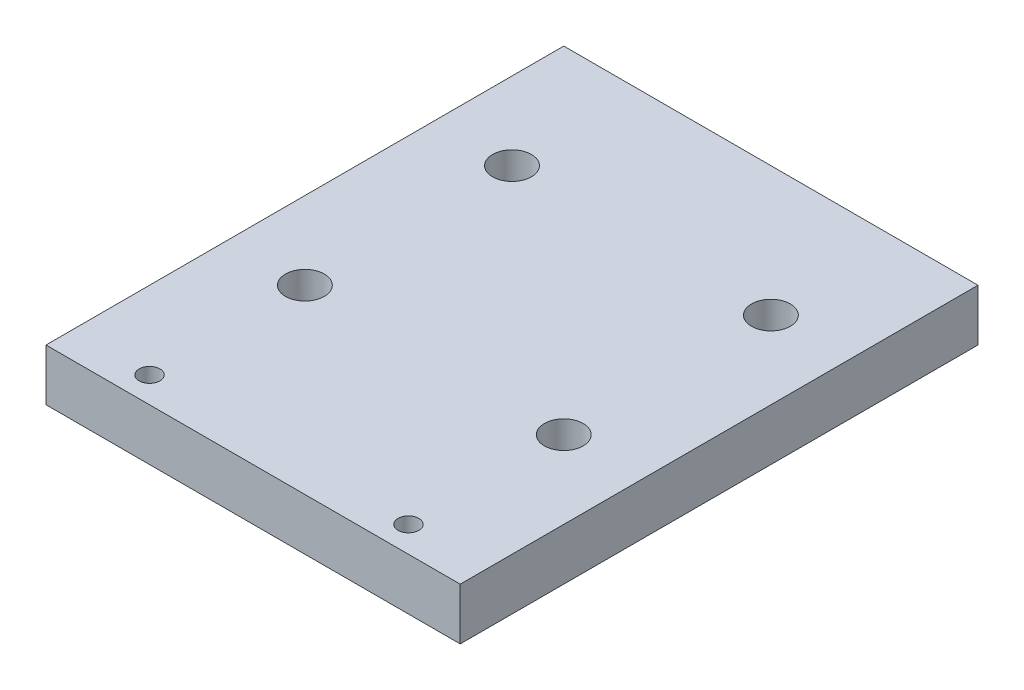
ISO-10303-21;
HEADER;
FILE_DESCRIPTION(('STEP AP214'),'2;1');
FILE_NAME('part.step','',(''),(''),'','','');
FILE_SCHEMA(('AUTOMOTIVE_DESIGN { 1 0 10303 214 1 1 1 1 }'));
ENDSEC;
DATA;
#1=APPLICATION_CONTEXT('core data for automotive mechanical design processes');
#2=APPLICATION_PROTOCOL_DEFINITION('international standard','automotive_design',2000,#1);
#3=PRODUCT_CONTEXT('',#1,'mechanical');
#4=PRODUCT('Part','Part','',(#3));
#5=PRODUCT_RELATED_PRODUCT_CATEGORY('part','',(#4));
#6=PRODUCT_DEFINITION_FORMATION('','',#4);
#7=PRODUCT_DEFINITION_CONTEXT('part definition',#1,'design');
#8=PRODUCT_DEFINITION('design','',#6,#7);
#9=PRODUCT_DEFINITION_SHAPE('','',#8);
#10=(LENGTH_UNIT() NAMED_UNIT(*) SI_UNIT(.MILLI.,.METRE.));
#11=(NAMED_UNIT(*) PLANE_ANGLE_UNIT() SI_UNIT($,.RADIAN.));
#12=(NAMED_UNIT(*) SI_UNIT($,.STERADIAN.) SOLID_ANGLE_UNIT());
#13=UNCERTAINTY_MEASURE_WITH_UNIT(LENGTH_MEASURE(1.E-05),#10,'distance_accuracy_value','');
#14=(GEOMETRIC_REPRESENTATION_CONTEXT(3) GLOBAL_UNCERTAINTY_ASSIGNED_CONTEXT((#13)) GLOBAL_UNIT_ASSIGNED_CONTEXT((#10,
#11,#12)) REPRESENTATION_CONTEXT('',''));
#15=CARTESIAN_POINT('',(0.,0.,0.));
#16=DIRECTION('',(0.,0.,1.));
#17=DIRECTION('',(1.,0.,0.));
#18=AXIS2_PLACEMENT_3D('',#15,#16,#17);
#19=CARTESIAN_POINT('',(-50.8,12.7,63.5));
#20=DIRECTION('',(-1.,0.,0.));
#21=DIRECTION('',(0.,0.,1.));
#22=AXIS2_PLACEMENT_3D('',#19,#20,#21);
#23=PLANE('',#22);
#24=DIRECTION('',(0.,0.,-1.));
#25=VECTOR('',#24,1.);
#26=CARTESIAN_POINT('',(-50.8,0.,63.5));
#27=LINE('',#26,#25);
#28=CARTESIAN_POINT('',(-50.8,0.,63.5));
#29=VERTEX_POINT('',#28);
#30=CARTESIAN_POINT('',(-50.8,0.,-63.5));
#31=VERTEX_POINT('',#30);
#32=EDGE_CURVE('E99',#29,#31,#27,.T.);
#33=ORIENTED_EDGE('',*,*,#32,.F.);
#34=DIRECTION('',(0.,-1.,0.));
#35=VECTOR('',#34,1.);
#36=CARTESIAN_POINT('',(-50.8,12.7,63.5));
#37=LINE('',#36,#35);
#38=CARTESIAN_POINT('',(-50.8,12.7,63.5));
#39=VERTEX_POINT('',#38);
#40=EDGE_CURVE('E11',#39,#29,#37,.T.);
#41=ORIENTED_EDGE('',*,*,#40,.F.);
#42=DIRECTION('',(0.,0.,-1.));
#43=VECTOR('',#42,1.);
#44=CARTESIAN_POINT('',(-50.8,12.7,63.5));
#45=LINE('',#44,#43);
#46=CARTESIAN_POINT('',(-50.8,12.7,-63.5));
#47=VERTEX_POINT('',#46);
#48=EDGE_CURVE('E93',#39,#47,#45,.T.);
#49=ORIENTED_EDGE('',*,*,#48,.T.);
#50=DIRECTION('',(0.,-1.,0.));
#51=VECTOR('',#50,1.);
#52=CARTESIAN_POINT('',(-50.8,12.7,-63.5));
#53=LINE('',#52,#51);
#54=EDGE_CURVE('E36',#47,#31,#53,.T.);
#55=ORIENTED_EDGE('',*,*,#54,.T.);
#56=EDGE_LOOP('',(#33,#41,#49,#55));
#57=FACE_BOUND('',#56,.T.);
#58=ADVANCED_FACE('F33',(#57),#23,.T.);
#59=CARTESIAN_POINT('',(-50.8,12.7,63.5));
#60=DIRECTION('',(0.,0.,-1.));
#61=DIRECTION('',(-1.,0.,0.));
#62=AXIS2_PLACEMENT_3D('',#59,#60,#61);
#63=PLANE('',#62);
#64=DIRECTION('',(1.,0.,0.));
#65=VECTOR('',#64,1.);
#66=CARTESIAN_POINT('',(-50.8,0.,63.5));
#67=LINE('',#66,#65);
#68=CARTESIAN_POINT('',(50.8,0.,63.5));
#69=VERTEX_POINT('',#68);
#70=EDGE_CURVE('E66',#29,#69,#67,.T.);
#71=ORIENTED_EDGE('',*,*,#70,.T.);
#72=DIRECTION('',(0.,-1.,0.));
#73=VECTOR('',#72,1.);
#74=CARTESIAN_POINT('',(50.8,12.7,63.5));
#75=LINE('',#74,#73);
#76=CARTESIAN_POINT('',(50.8,12.7,63.5));
#77=VERTEX_POINT('',#76);
#78=EDGE_CURVE('E42',#77,#69,#75,.T.);
#79=ORIENTED_EDGE('',*,*,#78,.F.);
#80=DIRECTION('',(1.,0.,0.));
#81=VECTOR('',#80,1.);
#82=CARTESIAN_POINT('',(-50.8,12.7,63.5));
#83=LINE('',#82,#81);
#84=EDGE_CURVE('E83',#39,#77,#83,.T.);
#85=ORIENTED_EDGE('',*,*,#84,.F.);
#86=ORIENTED_EDGE('',*,*,#40,.T.);
#87=EDGE_LOOP('',(#71,#79,#85,#86));
#88=FACE_BOUND('',#87,.T.);
#89=ADVANCED_FACE('F110',(#88),#63,.F.);
#90=CARTESIAN_POINT('',(50.8,12.7,63.5));
#91=DIRECTION('',(-1.,0.,0.));
#92=DIRECTION('',(0.,0.,1.));
#93=AXIS2_PLACEMENT_3D('',#90,#91,#92);
#94=PLANE('',#93);
#95=DIRECTION('',(0.,0.,-1.));
#96=VECTOR('',#95,1.);
#97=CARTESIAN_POINT('',(50.8,0.,63.5));
#98=LINE('',#97,#96);
#99=CARTESIAN_POINT('',(50.8,0.,-63.5));
#100=VERTEX_POINT('',#99);
#101=EDGE_CURVE('E90',#69,#100,#98,.T.);
#102=ORIENTED_EDGE('',*,*,#101,.T.);
#103=DIRECTION('',(0.,-1.,0.));
#104=VECTOR('',#103,1.);
#105=CARTESIAN_POINT('',(50.8,12.7,-63.5));
#106=LINE('',#105,#104);
#107=CARTESIAN_POINT('',(50.8,12.7,-63.5));
#108=VERTEX_POINT('',#107);
#109=EDGE_CURVE('E87',#108,#100,#106,.T.);
#110=ORIENTED_EDGE('',*,*,#109,.F.);
#111=DIRECTION('',(0.,0.,-1.));
#112=VECTOR('',#111,1.);
#113=CARTESIAN_POINT('',(50.8,12.7,63.5));
#114=LINE('',#113,#112);
#115=EDGE_CURVE('E78',#77,#108,#114,.T.);
#116=ORIENTED_EDGE('',*,*,#115,.F.);
#117=ORIENTED_EDGE('',*,*,#78,.T.);
#118=EDGE_LOOP('',(#102,#110,#116,#117));
#119=FACE_BOUND('',#118,.T.);
#120=ADVANCED_FACE('F88',(#119),#94,.F.);
#121=CARTESIAN_POINT('',(-50.8,12.7,-63.5));
#122=DIRECTION('',(0.,0.,-1.));
#123=DIRECTION('',(-1.,0.,0.));
#124=AXIS2_PLACEMENT_3D('',#121,#122,#123);
#125=PLANE('',#124);
#126=DIRECTION('',(1.,0.,0.));
#127=VECTOR('',#126,1.);
#128=CARTESIAN_POINT('',(-50.8,0.,-63.5));
#129=LINE('',#128,#127);
#130=EDGE_CURVE('E102',#31,#100,#129,.T.);
#131=ORIENTED_EDGE('',*,*,#130,.F.);
#132=ORIENTED_EDGE('',*,*,#54,.F.);
#133=DIRECTION('',(1.,0.,0.));
#134=VECTOR('',#133,1.);
#135=CARTESIAN_POINT('',(-50.8,12.7,-63.5));
#136=LINE('',#135,#134);
#137=EDGE_CURVE('E82',#47,#108,#136,.T.);
#138=ORIENTED_EDGE('',*,*,#137,.T.);
#139=ORIENTED_EDGE('',*,*,#109,.T.);
#140=EDGE_LOOP('',(#131,#132,#138,#139));
#141=FACE_BOUND('',#140,.T.);
#142=ADVANCED_FACE('F92',(#141),#125,.T.);
#143=CARTESIAN_POINT('',(0.,12.7,0.));
#144=DIRECTION('',(0.,-1.,0.));
#145=DIRECTION('',(0.,0.,-1.));
#146=AXIS2_PLACEMENT_3D('',#143,#144,#145);
#147=PLANE('',#146);
#148=CARTESIAN_POINT('',(-31.75,12.7,-31.75));
#149=DIRECTION('',(0.,1.,0.));
#150=DIRECTION('',(0.,0.,1.));
#151=AXIS2_PLACEMENT_3D('',#148,#149,#150);
#152=CIRCLE('',#151,4.7625);
#153=CARTESIAN_POINT('',(-31.75,12.7,-26.9875));
#154=VERTEX_POINT('',#153);
#155=EDGE_CURVE('E171',#154,#154,#152,.T.);
#156=ORIENTED_EDGE('',*,*,#155,.F.);
#157=EDGE_LOOP('',(#156));
#158=FACE_BOUND('',#157,.T.);
#159=CARTESIAN_POINT('',(31.75,12.7,-31.75));
#160=DIRECTION('',(0.,1.,0.));
#161=DIRECTION('',(0.,0.,1.));
#162=AXIS2_PLACEMENT_3D('',#159,#160,#161);
#163=CIRCLE('',#162,4.7625);
#164=CARTESIAN_POINT('',(31.75,12.7,-26.9875));
#165=VERTEX_POINT('',#164);
#166=EDGE_CURVE('E173',#165,#165,#163,.T.);
#167=ORIENTED_EDGE('',*,*,#166,.F.);
#168=EDGE_LOOP('',(#167));
#169=FACE_BOUND('',#168,.T.);
#170=CARTESIAN_POINT('',(-31.75,12.7,19.05));
#171=DIRECTION('',(0.,1.,0.));
#172=DIRECTION('',(0.,0.,1.));
#173=AXIS2_PLACEMENT_3D('',#170,#171,#172);
#174=CIRCLE('',#173,4.7625);
#175=CARTESIAN_POINT('',(-31.75,12.7,23.8125));
#176=VERTEX_POINT('',#175);
#177=EDGE_CURVE('E181',#176,#176,#174,.T.);
#178=ORIENTED_EDGE('',*,*,#177,.F.);
#179=EDGE_LOOP('',(#178));
#180=FACE_BOUND('',#179,.T.);
#181=CARTESIAN_POINT('',(31.75,12.7,19.05));
#182=DIRECTION('',(0.,1.,0.));
#183=DIRECTION('',(0.,0.,1.));
#184=AXIS2_PLACEMENT_3D('',#181,#182,#183);
#185=CIRCLE('',#184,4.7625);
#186=CARTESIAN_POINT('',(31.75,12.7,23.8125));
#187=VERTEX_POINT('',#186);
#188=EDGE_CURVE('E187',#187,#187,#185,.T.);
#189=ORIENTED_EDGE('',*,*,#188,.F.);
#190=EDGE_LOOP('',(#189));
#191=FACE_BOUND('',#190,.T.);
#192=CARTESIAN_POINT('',(-31.75,12.7,57.15));
#193=DIRECTION('',(0.,-1.,0.));
#194=DIRECTION('',(0.,0.,-1.));
#195=AXIS2_PLACEMENT_3D('',#192,#193,#194);
#196=CIRCLE('',#195,2.55269999999999);
#197=CARTESIAN_POINT('',(-31.75,12.7,54.5973));
#198=VERTEX_POINT('',#197);
#199=EDGE_CURVE('E199',#198,#198,#196,.T.);
#200=ORIENTED_EDGE('',*,*,#199,.T.);
#201=EDGE_LOOP('',(#200));
#202=FACE_BOUND('',#201,.T.);
#203=CARTESIAN_POINT('',(31.75,12.7,57.15));
#204=DIRECTION('',(0.,-1.,0.));
#205=DIRECTION('',(0.,0.,-1.));
#206=AXIS2_PLACEMENT_3D('',#203,#204,#205);
#207=CIRCLE('',#206,2.55269999999999);
#208=CARTESIAN_POINT('',(31.75,12.7,54.5973));
#209=VERTEX_POINT('',#208);
#210=EDGE_CURVE('E103',#209,#209,#207,.T.);
#211=ORIENTED_EDGE('',*,*,#210,.T.);
#212=EDGE_LOOP('',(#211));
#213=FACE_BOUND('',#212,.T.);
#214=ORIENTED_EDGE('',*,*,#48,.F.);
#215=ORIENTED_EDGE('',*,*,#84,.T.);
#216=ORIENTED_EDGE('',*,*,#115,.T.);
#217=ORIENTED_EDGE('',*,*,#137,.F.);
#218=EDGE_LOOP('',(#214,#215,#216,#217));
#219=FACE_BOUND('',#218,.T.);
#220=ADVANCED_FACE('F81',(#158,#169,#180,#191,#202,#213,#219),#147,.F.);
#221=CARTESIAN_POINT('',(0.,0.,0.));
#222=DIRECTION('',(0.,-1.,0.));
#223=DIRECTION('',(0.,0.,-1.));
#224=AXIS2_PLACEMENT_3D('',#221,#222,#223);
#225=PLANE('',#224);
#226=CARTESIAN_POINT('',(-31.75,0.,-31.75));
#227=DIRECTION('',(0.,-1.,0.));
#228=DIRECTION('',(0.,0.,-1.));
#229=AXIS2_PLACEMENT_3D('',#226,#227,#228);
#230=CIRCLE('',#229,4.76249999999999);
#231=CARTESIAN_POINT('',(-31.75,0.,-36.5125));
#232=VERTEX_POINT('',#231);
#233=EDGE_CURVE('E169',#232,#232,#230,.T.);
#234=ORIENTED_EDGE('',*,*,#233,.F.);
#235=EDGE_LOOP('',(#234));
#236=FACE_BOUND('',#235,.T.);
#237=CARTESIAN_POINT('',(31.75,0.,-31.75));
#238=DIRECTION('',(0.,-1.,0.));
#239=DIRECTION('',(0.,0.,-1.));
#240=AXIS2_PLACEMENT_3D('',#237,#238,#239);
#241=CIRCLE('',#240,4.76249999999999);
#242=CARTESIAN_POINT('',(31.75,0.,-36.5125));
#243=VERTEX_POINT('',#242);
#244=EDGE_CURVE('E178',#243,#243,#241,.T.);
#245=ORIENTED_EDGE('',*,*,#244,.F.);
#246=EDGE_LOOP('',(#245));
#247=FACE_BOUND('',#246,.T.);
#248=CARTESIAN_POINT('',(-31.75,0.,19.05));
#249=DIRECTION('',(0.,-1.,0.));
#250=DIRECTION('',(0.,0.,-1.));
#251=AXIS2_PLACEMENT_3D('',#248,#249,#250);
#252=CIRCLE('',#251,4.76249999999999);
#253=CARTESIAN_POINT('',(-31.75,0.,14.2875));
#254=VERTEX_POINT('',#253);
#255=EDGE_CURVE('E184',#254,#254,#252,.T.);
#256=ORIENTED_EDGE('',*,*,#255,.F.);
#257=EDGE_LOOP('',(#256));
#258=FACE_BOUND('',#257,.T.);
#259=CARTESIAN_POINT('',(31.75,0.,19.05));
#260=DIRECTION('',(0.,-1.,0.));
#261=DIRECTION('',(0.,0.,-1.));
#262=AXIS2_PLACEMENT_3D('',#259,#260,#261);
#263=CIRCLE('',#262,4.76249999999999);
#264=CARTESIAN_POINT('',(31.75,0.,14.2875));
#265=VERTEX_POINT('',#264);
#266=EDGE_CURVE('E190',#265,#265,#263,.T.);
#267=ORIENTED_EDGE('',*,*,#266,.F.);
#268=EDGE_LOOP('',(#267));
#269=FACE_BOUND('',#268,.T.);
#270=CARTESIAN_POINT('',(-31.75,0.,57.15));
#271=DIRECTION('',(0.,-1.,0.));
#272=DIRECTION('',(0.,0.,-1.));
#273=AXIS2_PLACEMENT_3D('',#270,#271,#272);
#274=CIRCLE('',#273,4.8895);
#275=CARTESIAN_POINT('',(-31.75,0.,52.2605));
#276=VERTEX_POINT('',#275);
#277=EDGE_CURVE('E193',#276,#276,#274,.T.);
#278=ORIENTED_EDGE('',*,*,#277,.F.);
#279=EDGE_LOOP('',(#278));
#280=FACE_BOUND('',#279,.T.);
#281=CARTESIAN_POINT('',(31.75,0.,57.15));
#282=DIRECTION('',(0.,-1.,0.));
#283=DIRECTION('',(0.,0.,-1.));
#284=AXIS2_PLACEMENT_3D('',#281,#282,#283);
#285=CIRCLE('',#284,4.8895);
#286=CARTESIAN_POINT('',(31.75,0.,52.2605));
#287=VERTEX_POINT('',#286);
#288=EDGE_CURVE('E202',#287,#287,#285,.T.);
#289=ORIENTED_EDGE('',*,*,#288,.F.);
#290=EDGE_LOOP('',(#289));
#291=FACE_BOUND('',#290,.T.);
#292=ORIENTED_EDGE('',*,*,#32,.T.);
#293=ORIENTED_EDGE('',*,*,#130,.T.);
#294=ORIENTED_EDGE('',*,*,#101,.F.);
#295=ORIENTED_EDGE('',*,*,#70,.F.);
#296=EDGE_LOOP('',(#292,#293,#294,#295));
#297=FACE_BOUND('',#296,.T.);
#298=ADVANCED_FACE('F108',(#236,#247,#258,#269,#280,#291,#297),#225,.T.);
#299=CARTESIAN_POINT('',(31.75,0.,57.15));
#300=DIRECTION('',(0.,-1.,0.));
#301=DIRECTION('',(0.,0.,-1.));
#302=AXIS2_PLACEMENT_3D('',#299,#300,#301);
#303=CYLINDRICAL_SURFACE('',#302,2.55269999999999);
#304=ORIENTED_EDGE('',*,*,#210,.F.);
#305=EDGE_LOOP('',(#304));
#306=FACE_BOUND('',#305,.T.);
#307=CARTESIAN_POINT('',(31.75,1.96080801813507,57.15));
#308=DIRECTION('',(0.,-1.,0.));
#309=DIRECTION('',(0.,0.,-1.));
#310=AXIS2_PLACEMENT_3D('',#307,#308,#309);
#311=CIRCLE('',#310,2.5527);
#312=CARTESIAN_POINT('',(31.75,1.96080801813507,54.5973));
#313=VERTEX_POINT('',#312);
#314=EDGE_CURVE('E205',#313,#313,#311,.T.);
#315=ORIENTED_EDGE('',*,*,#314,.T.);
#316=EDGE_LOOP('',(#315));
#317=FACE_BOUND('',#316,.T.);
#318=ADVANCED_FACE('F129',(#306,#317),#303,.F.);
#319=CARTESIAN_POINT('',(31.75,0.,57.15));
#320=DIRECTION('',(0.,-1.,0.));
#321=DIRECTION('',(0.,0.,-1.));
#322=AXIS2_PLACEMENT_3D('',#319,#320,#321);
#323=CONICAL_SURFACE('',#322,4.8895,0.872664625997164);
#324=ORIENTED_EDGE('',*,*,#314,.F.);
#325=EDGE_LOOP('',(#324));
#326=FACE_BOUND('',#325,.T.);
#327=ORIENTED_EDGE('',*,*,#288,.T.);
#328=EDGE_LOOP('',(#327));
#329=FACE_BOUND('',#328,.T.);
#330=ADVANCED_FACE('F136',(#326,#329),#323,.F.);
#331=CARTESIAN_POINT('',(-31.75,0.,57.15));
#332=DIRECTION('',(0.,-1.,0.));
#333=DIRECTION('',(0.,0.,-1.));
#334=AXIS2_PLACEMENT_3D('',#331,#332,#333);
#335=CYLINDRICAL_SURFACE('',#334,2.55269999999999);
#336=ORIENTED_EDGE('',*,*,#199,.F.);
#337=EDGE_LOOP('',(#336));
#338=FACE_BOUND('',#337,.T.);
#339=CARTESIAN_POINT('',(-31.75,1.96080801813507,57.15));
#340=DIRECTION('',(0.,-1.,0.));
#341=DIRECTION('',(0.,0.,-1.));
#342=AXIS2_PLACEMENT_3D('',#339,#340,#341);
#343=CIRCLE('',#342,2.5527);
#344=CARTESIAN_POINT('',(-31.75,1.96080801813507,54.5973));
#345=VERTEX_POINT('',#344);
#346=EDGE_CURVE('E196',#345,#345,#343,.T.);
#347=ORIENTED_EDGE('',*,*,#346,.T.);
#348=EDGE_LOOP('',(#347));
#349=FACE_BOUND('',#348,.T.);
#350=ADVANCED_FACE('F140',(#338,#349),#335,.F.);
#351=CARTESIAN_POINT('',(-31.75,0.,57.15));
#352=DIRECTION('',(0.,-1.,0.));
#353=DIRECTION('',(0.,0.,-1.));
#354=AXIS2_PLACEMENT_3D('',#351,#352,#353);
#355=CONICAL_SURFACE('',#354,4.8895,0.872664625997164);
#356=ORIENTED_EDGE('',*,*,#346,.F.);
#357=EDGE_LOOP('',(#356));
#358=FACE_BOUND('',#357,.T.);
#359=ORIENTED_EDGE('',*,*,#277,.T.);
#360=EDGE_LOOP('',(#359));
#361=FACE_BOUND('',#360,.T.);
#362=ADVANCED_FACE('F144',(#358,#361),#355,.F.);
#363=CARTESIAN_POINT('',(31.75,12.7,19.05));
#364=DIRECTION('',(0.,1.,0.));
#365=DIRECTION('',(0.,0.,1.));
#366=AXIS2_PLACEMENT_3D('',#363,#364,#365);
#367=CYLINDRICAL_SURFACE('',#366,4.76249999999999);
#368=ORIENTED_EDGE('',*,*,#266,.T.);
#369=EDGE_LOOP('',(#368));
#370=FACE_BOUND('',#369,.T.);
#371=ORIENTED_EDGE('',*,*,#188,.T.);
#372=EDGE_LOOP('',(#371));
#373=FACE_BOUND('',#372,.T.);
#374=ADVANCED_FACE('F148',(#370,#373),#367,.F.);
#375=CARTESIAN_POINT('',(-31.75,12.7,19.05));
#376=DIRECTION('',(0.,1.,0.));
#377=DIRECTION('',(0.,0.,1.));
#378=AXIS2_PLACEMENT_3D('',#375,#376,#377);
#379=CYLINDRICAL_SURFACE('',#378,4.76249999999999);
#380=ORIENTED_EDGE('',*,*,#255,.T.);
#381=EDGE_LOOP('',(#380));
#382=FACE_BOUND('',#381,.T.);
#383=ORIENTED_EDGE('',*,*,#177,.T.);
#384=EDGE_LOOP('',(#383));
#385=FACE_BOUND('',#384,.T.);
#386=ADVANCED_FACE('F152',(#382,#385),#379,.F.);
#387=CARTESIAN_POINT('',(31.75,12.7,-31.75));
#388=DIRECTION('',(0.,1.,0.));
#389=DIRECTION('',(0.,0.,1.));
#390=AXIS2_PLACEMENT_3D('',#387,#388,#389);
#391=CYLINDRICAL_SURFACE('',#390,4.76249999999999);
#392=ORIENTED_EDGE('',*,*,#244,.T.);
#393=EDGE_LOOP('',(#392));
#394=FACE_BOUND('',#393,.T.);
#395=ORIENTED_EDGE('',*,*,#166,.T.);
#396=EDGE_LOOP('',(#395));
#397=FACE_BOUND('',#396,.T.);
#398=ADVANCED_FACE('F156',(#394,#397),#391,.F.);
#399=CARTESIAN_POINT('',(-31.75,12.7,-31.75));
#400=DIRECTION('',(0.,1.,0.));
#401=DIRECTION('',(0.,0.,1.));
#402=AXIS2_PLACEMENT_3D('',#399,#400,#401);
#403=CYLINDRICAL_SURFACE('',#402,4.76249999999999);
#404=ORIENTED_EDGE('',*,*,#233,.T.);
#405=EDGE_LOOP('',(#404));
#406=FACE_BOUND('',#405,.T.);
#407=ORIENTED_EDGE('',*,*,#155,.T.);
#408=EDGE_LOOP('',(#407));
#409=FACE_BOUND('',#408,.T.);
#410=ADVANCED_FACE('F160',(#406,#409),#403,.F.);
#411=CLOSED_SHELL('',(#58,#89,#120,#142,#220,#298,#318,#330,#350,#362,#374,#386,#398,#410));
#412=MANIFOLD_SOLID_BREP('B2',#411);
#413=ADVANCED_BREP_SHAPE_REPRESENTATION('',(#18,#412),#14);
#414=SHAPE_DEFINITION_REPRESENTATION(#9,#413);
ENDSEC;
END-ISO-10303-21;
